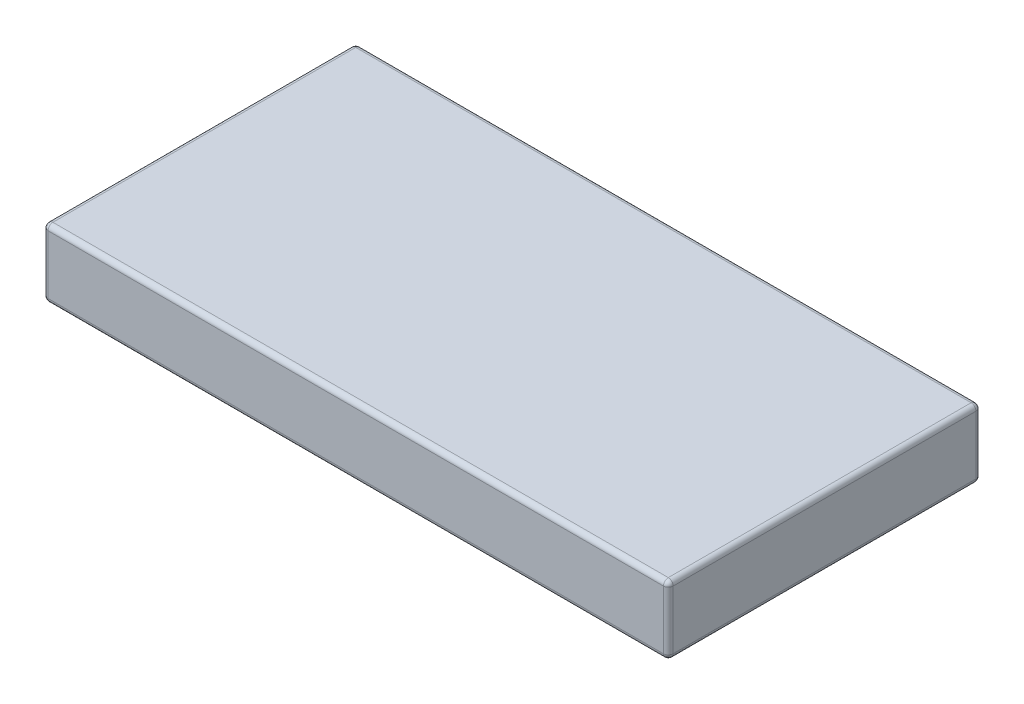
ISO-10303-21;
HEADER;
FILE_DESCRIPTION(('STEP AP214'),'2;1');
FILE_NAME('part.step','',(''),(''),'','','');
FILE_SCHEMA(('AUTOMOTIVE_DESIGN { 1 0 10303 214 1 1 1 1 }'));
ENDSEC;
DATA;
#1=APPLICATION_CONTEXT('core data for automotive mechanical design processes');
#2=APPLICATION_PROTOCOL_DEFINITION('international standard','automotive_design',2000,#1);
#3=PRODUCT_CONTEXT('',#1,'mechanical');
#4=PRODUCT('Part','Part','',(#3));
#5=PRODUCT_RELATED_PRODUCT_CATEGORY('part','',(#4));
#6=PRODUCT_DEFINITION_FORMATION('','',#4);
#7=PRODUCT_DEFINITION_CONTEXT('part definition',#1,'design');
#8=PRODUCT_DEFINITION('design','',#6,#7);
#9=PRODUCT_DEFINITION_SHAPE('','',#8);
#10=(LENGTH_UNIT() NAMED_UNIT(*) SI_UNIT(.MILLI.,.METRE.));
#11=(NAMED_UNIT(*) PLANE_ANGLE_UNIT() SI_UNIT($,.RADIAN.));
#12=(NAMED_UNIT(*) SI_UNIT($,.STERADIAN.) SOLID_ANGLE_UNIT());
#13=UNCERTAINTY_MEASURE_WITH_UNIT(LENGTH_MEASURE(1.E-05),#10,'distance_accuracy_value','');
#14=(GEOMETRIC_REPRESENTATION_CONTEXT(3) GLOBAL_UNCERTAINTY_ASSIGNED_CONTEXT((#13)) GLOBAL_UNIT_ASSIGNED_CONTEXT((#10,
#11,#12)) REPRESENTATION_CONTEXT('',''));
#15=CARTESIAN_POINT('',(0.,0.,0.));
#16=DIRECTION('',(0.,0.,1.));
#17=DIRECTION('',(1.,0.,0.));
#18=AXIS2_PLACEMENT_3D('',#15,#16,#17);
#19=CARTESIAN_POINT('',(-3.15,0.65,-1.55));
#20=DIRECTION('',(1.,0.,0.));
#21=DIRECTION('',(0.,0.,-1.));
#22=AXIS2_PLACEMENT_3D('',#19,#20,#21);
#23=SPHERICAL_SURFACE('',#22,0.05);
#24=CARTESIAN_POINT('',(-3.15,0.65,-1.55));
#25=DIRECTION('',(0.,0.,1.));
#26=DIRECTION('',(1.,0.,0.));
#27=AXIS2_PLACEMENT_3D('',#24,#25,#26);
#28=CIRCLE('',#27,0.05);
#29=CARTESIAN_POINT('',(-3.15,0.7,-1.55));
#30=VERTEX_POINT('',#29);
#31=CARTESIAN_POINT('',(-3.2,0.65,-1.55));
#32=VERTEX_POINT('',#31);
#33=EDGE_CURVE('E124',#30,#32,#28,.T.);
#34=ORIENTED_EDGE('',*,*,#33,.F.);
#35=CARTESIAN_POINT('',(-3.15,0.65,-1.55));
#36=DIRECTION('',(-1.,0.,0.));
#37=DIRECTION('',(0.,0.,1.));
#38=AXIS2_PLACEMENT_3D('',#35,#36,#37);
#39=CIRCLE('',#38,0.05);
#40=CARTESIAN_POINT('',(-3.15,0.65,-1.6));
#41=VERTEX_POINT('',#40);
#42=EDGE_CURVE('E277',#41,#30,#39,.F.);
#43=ORIENTED_EDGE('',*,*,#42,.F.);
#44=CARTESIAN_POINT('',(-3.15,0.65,-1.55));
#45=DIRECTION('',(0.,-1.,0.));
#46=DIRECTION('',(0.,0.,-1.));
#47=AXIS2_PLACEMENT_3D('',#44,#45,#46);
#48=CIRCLE('',#47,0.05);
#49=EDGE_CURVE('E274',#32,#41,#48,.T.);
#50=ORIENTED_EDGE('',*,*,#49,.F.);
#51=EDGE_LOOP('',(#34,#43,#50));
#52=FACE_BOUND('',#51,.T.);
#53=ADVANCED_FACE('F17',(#52),#23,.T.);
#54=CARTESIAN_POINT('',(3.15,0.65,-1.55));
#55=DIRECTION('',(1.,0.,0.));
#56=DIRECTION('',(0.,0.,-1.));
#57=AXIS2_PLACEMENT_3D('',#54,#55,#56);
#58=SPHERICAL_SURFACE('',#57,0.05);
#59=CARTESIAN_POINT('',(3.15,0.65,-1.55));
#60=DIRECTION('',(0.,0.,-1.));
#61=DIRECTION('',(-1.,0.,0.));
#62=AXIS2_PLACEMENT_3D('',#59,#60,#61);
#63=CIRCLE('',#62,0.05);
#64=CARTESIAN_POINT('',(3.2,0.65,-1.55));
#65=VERTEX_POINT('',#64);
#66=CARTESIAN_POINT('',(3.15,0.7,-1.55));
#67=VERTEX_POINT('',#66);
#68=EDGE_CURVE('E265',#65,#67,#63,.F.);
#69=ORIENTED_EDGE('',*,*,#68,.F.);
#70=CARTESIAN_POINT('',(3.15,0.65,-1.55));
#71=DIRECTION('',(0.,-1.,0.));
#72=DIRECTION('',(0.,0.,-1.));
#73=AXIS2_PLACEMENT_3D('',#70,#71,#72);
#74=CIRCLE('',#73,0.05);
#75=CARTESIAN_POINT('',(3.15,0.65,-1.6));
#76=VERTEX_POINT('',#75);
#77=EDGE_CURVE('E260',#76,#65,#74,.T.);
#78=ORIENTED_EDGE('',*,*,#77,.F.);
#79=CARTESIAN_POINT('',(3.15,0.65,-1.55));
#80=DIRECTION('',(-1.,0.,0.));
#81=DIRECTION('',(0.,0.,1.));
#82=AXIS2_PLACEMENT_3D('',#79,#80,#81);
#83=CIRCLE('',#82,0.05);
#84=EDGE_CURVE('E271',#67,#76,#83,.T.);
#85=ORIENTED_EDGE('',*,*,#84,.F.);
#86=EDGE_LOOP('',(#69,#78,#85));
#87=FACE_BOUND('',#86,.T.);
#88=ADVANCED_FACE('F152',(#87),#58,.T.);
#89=CARTESIAN_POINT('',(-3.15,0.65,1.55));
#90=DIRECTION('',(1.,0.,0.));
#91=DIRECTION('',(0.,0.,-1.));
#92=AXIS2_PLACEMENT_3D('',#89,#90,#91);
#93=SPHERICAL_SURFACE('',#92,0.05);
#94=CARTESIAN_POINT('',(-3.15,0.65,1.55));
#95=DIRECTION('',(0.,-1.,0.));
#96=DIRECTION('',(0.,0.,-1.));
#97=AXIS2_PLACEMENT_3D('',#94,#95,#96);
#98=CIRCLE('',#97,0.05);
#99=CARTESIAN_POINT('',(-3.15,0.65,1.6));
#100=VERTEX_POINT('',#99);
#101=CARTESIAN_POINT('',(-3.2,0.65,1.55));
#102=VERTEX_POINT('',#101);
#103=EDGE_CURVE('E132',#100,#102,#98,.T.);
#104=ORIENTED_EDGE('',*,*,#103,.F.);
#105=CARTESIAN_POINT('',(-3.15,0.65,1.55));
#106=DIRECTION('',(1.,0.,0.));
#107=DIRECTION('',(0.,0.,-1.));
#108=AXIS2_PLACEMENT_3D('',#105,#106,#107);
#109=CIRCLE('',#108,0.05);
#110=CARTESIAN_POINT('',(-3.15,0.7,1.55));
#111=VERTEX_POINT('',#110);
#112=EDGE_CURVE('E110',#111,#100,#109,.T.);
#113=ORIENTED_EDGE('',*,*,#112,.F.);
#114=CARTESIAN_POINT('',(-3.15,0.65,1.55));
#115=DIRECTION('',(0.,0.,1.));
#116=DIRECTION('',(1.,0.,0.));
#117=AXIS2_PLACEMENT_3D('',#114,#115,#116);
#118=CIRCLE('',#117,0.05);
#119=EDGE_CURVE('E125',#102,#111,#118,.F.);
#120=ORIENTED_EDGE('',*,*,#119,.F.);
#121=EDGE_LOOP('',(#104,#113,#120));
#122=FACE_BOUND('',#121,.T.);
#123=ADVANCED_FACE('F129',(#122),#93,.T.);
#124=CARTESIAN_POINT('',(3.15,0.65,1.55));
#125=DIRECTION('',(1.,0.,0.));
#126=DIRECTION('',(0.,0.,-1.));
#127=AXIS2_PLACEMENT_3D('',#124,#125,#126);
#128=SPHERICAL_SURFACE('',#127,0.05);
#129=CARTESIAN_POINT('',(3.15,0.65,1.55));
#130=DIRECTION('',(0.,-1.,0.));
#131=DIRECTION('',(0.,0.,-1.));
#132=AXIS2_PLACEMENT_3D('',#129,#130,#131);
#133=CIRCLE('',#132,0.05);
#134=CARTESIAN_POINT('',(3.2,0.65,1.55));
#135=VERTEX_POINT('',#134);
#136=CARTESIAN_POINT('',(3.15,0.65,1.6));
#137=VERTEX_POINT('',#136);
#138=EDGE_CURVE('E257',#135,#137,#133,.T.);
#139=ORIENTED_EDGE('',*,*,#138,.F.);
#140=CARTESIAN_POINT('',(3.15,0.65,1.55));
#141=DIRECTION('',(0.,0.,-1.));
#142=DIRECTION('',(-1.,0.,0.));
#143=AXIS2_PLACEMENT_3D('',#140,#141,#142);
#144=CIRCLE('',#143,0.05);
#145=CARTESIAN_POINT('',(3.15,0.7,1.55));
#146=VERTEX_POINT('',#145);
#147=EDGE_CURVE('E268',#146,#135,#144,.T.);
#148=ORIENTED_EDGE('',*,*,#147,.F.);
#149=CARTESIAN_POINT('',(3.15,0.65,1.55));
#150=DIRECTION('',(1.,0.,0.));
#151=DIRECTION('',(0.,0.,-1.));
#152=AXIS2_PLACEMENT_3D('',#149,#150,#151);
#153=CIRCLE('',#152,0.05);
#154=EDGE_CURVE('E112',#137,#146,#153,.F.);
#155=ORIENTED_EDGE('',*,*,#154,.F.);
#156=EDGE_LOOP('',(#139,#148,#155));
#157=FACE_BOUND('',#156,.T.);
#158=ADVANCED_FACE('F145',(#157),#128,.T.);
#159=CARTESIAN_POINT('',(-3.15,0.65,-1.6));
#160=DIRECTION('',(0.,0.,1.));
#161=DIRECTION('',(1.,0.,0.));
#162=AXIS2_PLACEMENT_3D('',#159,#160,#161);
#163=CYLINDRICAL_SURFACE('',#162,0.05);
#164=ORIENTED_EDGE('',*,*,#33,.T.);
#165=DIRECTION('',(0.,0.,-1.));
#166=VECTOR('',#165,1.);
#167=CARTESIAN_POINT('',(-3.2,0.65,1.6));
#168=LINE('',#167,#166);
#169=EDGE_CURVE('E137',#32,#102,#168,.F.);
#170=ORIENTED_EDGE('',*,*,#169,.T.);
#171=ORIENTED_EDGE('',*,*,#119,.T.);
#172=DIRECTION('',(0.,0.,1.));
#173=VECTOR('',#172,1.);
#174=CARTESIAN_POINT('',(-3.15,0.7,-1.6));
#175=LINE('',#174,#173);
#176=EDGE_CURVE('E119',#111,#30,#175,.F.);
#177=ORIENTED_EDGE('',*,*,#176,.T.);
#178=EDGE_LOOP('',(#164,#170,#171,#177));
#179=FACE_BOUND('',#178,.T.);
#180=ADVANCED_FACE('F135',(#179),#163,.T.);
#181=CARTESIAN_POINT('',(-3.15,0.7,-1.55));
#182=DIRECTION('',(0.,-1.,0.));
#183=DIRECTION('',(0.,0.,-1.));
#184=AXIS2_PLACEMENT_3D('',#181,#182,#183);
#185=CYLINDRICAL_SURFACE('',#184,0.05);
#186=ORIENTED_EDGE('',*,*,#49,.T.);
#187=DIRECTION('',(0.,1.,0.));
#188=VECTOR('',#187,1.);
#189=CARTESIAN_POINT('',(-3.15,0.7,-1.6));
#190=LINE('',#189,#188);
#191=CARTESIAN_POINT('',(-3.15,0.05,-1.6));
#192=VERTEX_POINT('',#191);
#193=EDGE_CURVE('E358',#41,#192,#190,.F.);
#194=ORIENTED_EDGE('',*,*,#193,.T.);
#195=CARTESIAN_POINT('',(-3.15,0.05,-1.55));
#196=DIRECTION('',(0.,1.,0.));
#197=DIRECTION('',(1.,0.,0.));
#198=AXIS2_PLACEMENT_3D('',#195,#196,#197);
#199=CIRCLE('',#198,0.05);
#200=CARTESIAN_POINT('',(-3.2,0.05,-1.55));
#201=VERTEX_POINT('',#200);
#202=EDGE_CURVE('E246',#201,#192,#199,.F.);
#203=ORIENTED_EDGE('',*,*,#202,.F.);
#204=DIRECTION('',(0.,1.,0.));
#205=VECTOR('',#204,1.);
#206=CARTESIAN_POINT('',(-3.2,0.7,-1.55));
#207=LINE('',#206,#205);
#208=EDGE_CURVE('E252',#201,#32,#207,.T.);
#209=ORIENTED_EDGE('',*,*,#208,.T.);
#210=EDGE_LOOP('',(#186,#194,#203,#209));
#211=FACE_BOUND('',#210,.T.);
#212=ADVANCED_FACE('F363',(#211),#185,.T.);
#213=CARTESIAN_POINT('',(3.15,0.65,-1.6));
#214=DIRECTION('',(0.,0.,-1.));
#215=DIRECTION('',(-1.,0.,0.));
#216=AXIS2_PLACEMENT_3D('',#213,#214,#215);
#217=CYLINDRICAL_SURFACE('',#216,0.05);
#218=ORIENTED_EDGE('',*,*,#68,.T.);
#219=DIRECTION('',(0.,0.,-1.));
#220=VECTOR('',#219,1.);
#221=CARTESIAN_POINT('',(3.15,0.7,-1.6));
#222=LINE('',#221,#220);
#223=EDGE_CURVE('E263',#67,#146,#222,.F.);
#224=ORIENTED_EDGE('',*,*,#223,.T.);
#225=ORIENTED_EDGE('',*,*,#147,.T.);
#226=DIRECTION('',(0.,0.,1.));
#227=VECTOR('',#226,1.);
#228=CARTESIAN_POINT('',(3.2,0.65,1.6));
#229=LINE('',#228,#227);
#230=EDGE_CURVE('E215',#135,#65,#229,.F.);
#231=ORIENTED_EDGE('',*,*,#230,.T.);
#232=EDGE_LOOP('',(#218,#224,#225,#231));
#233=FACE_BOUND('',#232,.T.);
#234=ADVANCED_FACE('F345',(#233),#217,.T.);
#235=CARTESIAN_POINT('',(3.15,0.7,-1.55));
#236=DIRECTION('',(0.,-1.,0.));
#237=DIRECTION('',(0.,0.,-1.));
#238=AXIS2_PLACEMENT_3D('',#235,#236,#237);
#239=CYLINDRICAL_SURFACE('',#238,0.05);
#240=CARTESIAN_POINT('',(3.15,0.05,-1.55));
#241=DIRECTION('',(0.,1.,0.));
#242=DIRECTION('',(1.,0.,0.));
#243=AXIS2_PLACEMENT_3D('',#240,#241,#242);
#244=CIRCLE('',#243,0.05);
#245=CARTESIAN_POINT('',(3.15,0.05,-1.6));
#246=VERTEX_POINT('',#245);
#247=CARTESIAN_POINT('',(3.2,0.05,-1.55));
#248=VERTEX_POINT('',#247);
#249=EDGE_CURVE('E221',#246,#248,#244,.F.);
#250=ORIENTED_EDGE('',*,*,#249,.F.);
#251=DIRECTION('',(0.,1.,0.));
#252=VECTOR('',#251,1.);
#253=CARTESIAN_POINT('',(3.15,0.7,-1.6));
#254=LINE('',#253,#252);
#255=EDGE_CURVE('E357',#246,#76,#254,.T.);
#256=ORIENTED_EDGE('',*,*,#255,.T.);
#257=ORIENTED_EDGE('',*,*,#77,.T.);
#258=DIRECTION('',(0.,1.,0.));
#259=VECTOR('',#258,1.);
#260=CARTESIAN_POINT('',(3.2,0.7,-1.55));
#261=LINE('',#260,#259);
#262=EDGE_CURVE('E213',#65,#248,#261,.F.);
#263=ORIENTED_EDGE('',*,*,#262,.T.);
#264=EDGE_LOOP('',(#250,#256,#257,#263));
#265=FACE_BOUND('',#264,.T.);
#266=ADVANCED_FACE('F352',(#265),#239,.T.);
#267=CARTESIAN_POINT('',(3.15,0.7,1.55));
#268=DIRECTION('',(0.,-1.,0.));
#269=DIRECTION('',(0.,0.,-1.));
#270=AXIS2_PLACEMENT_3D('',#267,#268,#269);
#271=CYLINDRICAL_SURFACE('',#270,0.05);
#272=CARTESIAN_POINT('',(3.15,0.05,1.55));
#273=DIRECTION('',(0.,-1.,9.5846697953635E-13));
#274=DIRECTION('',(1.,0.,0.));
#275=AXIS2_PLACEMENT_3D('',#272,#273,#274);
#276=CIRCLE('',#275,0.05);
#277=CARTESIAN_POINT('',(3.2,0.05,1.55));
#278=VERTEX_POINT('',#277);
#279=CARTESIAN_POINT('',(3.15,0.050000000000006,1.6));
#280=VERTEX_POINT('',#279);
#281=EDGE_CURVE('E206',#278,#280,#276,.T.);
#282=ORIENTED_EDGE('',*,*,#281,.F.);
#283=DIRECTION('',(0.,1.,0.));
#284=VECTOR('',#283,1.);
#285=CARTESIAN_POINT('',(3.2,0.7,1.55));
#286=LINE('',#285,#284);
#287=EDGE_CURVE('E218',#278,#135,#286,.T.);
#288=ORIENTED_EDGE('',*,*,#287,.T.);
#289=ORIENTED_EDGE('',*,*,#138,.T.);
#290=DIRECTION('',(0.,1.,0.));
#291=VECTOR('',#290,1.);
#292=CARTESIAN_POINT('',(3.15,0.7,1.6));
#293=LINE('',#292,#291);
#294=EDGE_CURVE('E204',#137,#280,#293,.F.);
#295=ORIENTED_EDGE('',*,*,#294,.T.);
#296=EDGE_LOOP('',(#282,#288,#289,#295));
#297=FACE_BOUND('',#296,.T.);
#298=ADVANCED_FACE('F329',(#297),#271,.T.);
#299=CARTESIAN_POINT('',(-3.15,0.7,1.55));
#300=DIRECTION('',(0.,-1.,0.));
#301=DIRECTION('',(0.,0.,-1.));
#302=AXIS2_PLACEMENT_3D('',#299,#300,#301);
#303=CYLINDRICAL_SURFACE('',#302,0.05);
#304=CARTESIAN_POINT('',(-3.15,0.05,1.55));
#305=DIRECTION('',(0.,-1.,0.));
#306=DIRECTION('',(1.,0.,0.));
#307=AXIS2_PLACEMENT_3D('',#304,#305,#306);
#308=CIRCLE('',#307,0.05);
#309=CARTESIAN_POINT('',(-3.15,0.05,1.6));
#310=VERTEX_POINT('',#309);
#311=CARTESIAN_POINT('',(-3.2,0.05,1.55));
#312=VERTEX_POINT('',#311);
#313=EDGE_CURVE('E208',#310,#312,#308,.T.);
#314=ORIENTED_EDGE('',*,*,#313,.F.);
#315=DIRECTION('',(0.,1.,0.));
#316=VECTOR('',#315,1.);
#317=CARTESIAN_POINT('',(-3.15,0.7,1.6));
#318=LINE('',#317,#316);
#319=EDGE_CURVE('E116',#310,#100,#318,.T.);
#320=ORIENTED_EDGE('',*,*,#319,.T.);
#321=ORIENTED_EDGE('',*,*,#103,.T.);
#322=DIRECTION('',(0.,1.,0.));
#323=VECTOR('',#322,1.);
#324=CARTESIAN_POINT('',(-3.2,0.7,1.55));
#325=LINE('',#324,#323);
#326=EDGE_CURVE('E249',#102,#312,#325,.F.);
#327=ORIENTED_EDGE('',*,*,#326,.T.);
#328=EDGE_LOOP('',(#314,#320,#321,#327));
#329=FACE_BOUND('',#328,.T.);
#330=ADVANCED_FACE('F290',(#329),#303,.T.);
#331=CARTESIAN_POINT('',(3.2,0.7,-1.6));
#332=DIRECTION('',(0.,-1.,0.));
#333=DIRECTION('',(0.,0.,-1.));
#334=AXIS2_PLACEMENT_3D('',#331,#332,#333);
#335=PLANE('',#334);
#336=DIRECTION('',(-1.,0.,0.));
#337=VECTOR('',#336,1.);
#338=CARTESIAN_POINT('',(3.2,0.7,-1.55));
#339=LINE('',#338,#337);
#340=EDGE_CURVE('E101',#30,#67,#339,.F.);
#341=ORIENTED_EDGE('',*,*,#340,.F.);
#342=ORIENTED_EDGE('',*,*,#176,.F.);
#343=DIRECTION('',(1.,0.,0.));
#344=VECTOR('',#343,1.);
#345=CARTESIAN_POINT('',(3.2,0.7,1.55));
#346=LINE('',#345,#344);
#347=EDGE_CURVE('E107',#146,#111,#346,.F.);
#348=ORIENTED_EDGE('',*,*,#347,.F.);
#349=ORIENTED_EDGE('',*,*,#223,.F.);
#350=EDGE_LOOP('',(#341,#342,#348,#349));
#351=FACE_BOUND('',#350,.T.);
#352=ADVANCED_FACE('F120',(#351),#335,.F.);
#353=CARTESIAN_POINT('',(-3.2,0.7,1.6));
#354=DIRECTION('',(1.,0.,0.));
#355=DIRECTION('',(0.,0.,-1.));
#356=AXIS2_PLACEMENT_3D('',#353,#354,#355);
#357=PLANE('',#356);
#358=ORIENTED_EDGE('',*,*,#169,.F.);
#359=ORIENTED_EDGE('',*,*,#208,.F.);
#360=DIRECTION('',(0.,0.,-1.));
#361=VECTOR('',#360,1.);
#362=CARTESIAN_POINT('',(-3.2,0.05,1.6));
#363=LINE('',#362,#361);
#364=EDGE_CURVE('E286',#312,#201,#363,.T.);
#365=ORIENTED_EDGE('',*,*,#364,.F.);
#366=ORIENTED_EDGE('',*,*,#326,.F.);
#367=EDGE_LOOP('',(#358,#359,#365,#366));
#368=FACE_BOUND('',#367,.T.);
#369=ADVANCED_FACE('F239',(#368),#357,.F.);
#370=CARTESIAN_POINT('',(-3.15,0.05,-1.55));
#371=DIRECTION('',(1.,0.,0.));
#372=DIRECTION('',(0.,0.,-1.));
#373=AXIS2_PLACEMENT_3D('',#370,#371,#372);
#374=SPHERICAL_SURFACE('',#373,0.05);
#375=ORIENTED_EDGE('',*,*,#202,.T.);
#376=CARTESIAN_POINT('',(-3.15,0.05,-1.55));
#377=DIRECTION('',(1.,0.,0.));
#378=DIRECTION('',(0.,0.,-1.));
#379=AXIS2_PLACEMENT_3D('',#376,#377,#378);
#380=CIRCLE('',#379,0.05);
#381=CARTESIAN_POINT('',(-3.15,0.,-1.55));
#382=VERTEX_POINT('',#381);
#383=EDGE_CURVE('E319',#382,#192,#380,.T.);
#384=ORIENTED_EDGE('',*,*,#383,.F.);
#385=CARTESIAN_POINT('',(-3.15,0.05,-1.55));
#386=DIRECTION('',(0.,0.,-1.));
#387=DIRECTION('',(-1.,0.,0.));
#388=AXIS2_PLACEMENT_3D('',#385,#386,#387);
#389=CIRCLE('',#388,0.05);
#390=EDGE_CURVE('E322',#201,#382,#389,.F.);
#391=ORIENTED_EDGE('',*,*,#390,.F.);
#392=EDGE_LOOP('',(#375,#384,#391));
#393=FACE_BOUND('',#392,.T.);
#394=ADVANCED_FACE('F234',(#393),#374,.T.);
#395=CARTESIAN_POINT('',(3.2,0.65,-1.55));
#396=DIRECTION('',(-1.,0.,0.));
#397=DIRECTION('',(0.,0.,1.));
#398=AXIS2_PLACEMENT_3D('',#395,#396,#397);
#399=CYLINDRICAL_SURFACE('',#398,0.05);
#400=ORIENTED_EDGE('',*,*,#340,.T.);
#401=ORIENTED_EDGE('',*,*,#84,.T.);
#402=DIRECTION('',(1.,0.,0.));
#403=VECTOR('',#402,1.);
#404=CARTESIAN_POINT('',(-3.2,0.65,-1.6));
#405=LINE('',#404,#403);
#406=EDGE_CURVE('E317',#76,#41,#405,.F.);
#407=ORIENTED_EDGE('',*,*,#406,.T.);
#408=ORIENTED_EDGE('',*,*,#42,.T.);
#409=EDGE_LOOP('',(#400,#401,#407,#408));
#410=FACE_BOUND('',#409,.T.);
#411=ADVANCED_FACE('F230',(#410),#399,.T.);
#412=CARTESIAN_POINT('',(3.15,0.05,-1.55));
#413=DIRECTION('',(1.,0.,0.));
#414=DIRECTION('',(0.,0.,-1.));
#415=AXIS2_PLACEMENT_3D('',#412,#413,#414);
#416=SPHERICAL_SURFACE('',#415,0.05);
#417=CARTESIAN_POINT('',(3.15,0.05,-1.55));
#418=DIRECTION('',(1.,0.,0.));
#419=DIRECTION('',(0.,0.,-1.));
#420=AXIS2_PLACEMENT_3D('',#417,#418,#419);
#421=CIRCLE('',#420,0.05);
#422=CARTESIAN_POINT('',(3.15,0.,-1.55));
#423=VERTEX_POINT('',#422);
#424=EDGE_CURVE('E314',#246,#423,#421,.F.);
#425=ORIENTED_EDGE('',*,*,#424,.F.);
#426=ORIENTED_EDGE('',*,*,#249,.T.);
#427=CARTESIAN_POINT('',(3.15,0.05,-1.55));
#428=DIRECTION('',(0.,0.,1.));
#429=DIRECTION('',(1.,0.,0.));
#430=AXIS2_PLACEMENT_3D('',#427,#428,#429);
#431=CIRCLE('',#430,0.05);
#432=EDGE_CURVE('E305',#423,#248,#431,.T.);
#433=ORIENTED_EDGE('',*,*,#432,.F.);
#434=EDGE_LOOP('',(#425,#426,#433));
#435=FACE_BOUND('',#434,.T.);
#436=ADVANCED_FACE('F226',(#435),#416,.T.);
#437=CARTESIAN_POINT('',(3.2,0.7,1.6));
#438=DIRECTION('',(-1.,0.,0.));
#439=DIRECTION('',(0.,0.,1.));
#440=AXIS2_PLACEMENT_3D('',#437,#438,#439);
#441=PLANE('',#440);
#442=ORIENTED_EDGE('',*,*,#230,.F.);
#443=ORIENTED_EDGE('',*,*,#287,.F.);
#444=DIRECTION('',(0.,0.,1.));
#445=VECTOR('',#444,1.);
#446=CARTESIAN_POINT('',(3.2,0.05,1.6));
#447=LINE('',#446,#445);
#448=EDGE_CURVE('E299',#248,#278,#447,.T.);
#449=ORIENTED_EDGE('',*,*,#448,.F.);
#450=ORIENTED_EDGE('',*,*,#262,.F.);
#451=EDGE_LOOP('',(#442,#443,#449,#450));
#452=FACE_BOUND('',#451,.T.);
#453=ADVANCED_FACE('F229',(#452),#441,.F.);
#454=CARTESIAN_POINT('',(-3.15,0.05,1.55));
#455=DIRECTION('',(1.,0.,0.));
#456=DIRECTION('',(0.,0.,-1.));
#457=AXIS2_PLACEMENT_3D('',#454,#455,#456);
#458=SPHERICAL_SURFACE('',#457,0.05);
#459=ORIENTED_EDGE('',*,*,#313,.T.);
#460=CARTESIAN_POINT('',(-3.15,0.05,1.55));
#461=DIRECTION('',(0.,0.,-1.));
#462=DIRECTION('',(-1.,0.,0.));
#463=AXIS2_PLACEMENT_3D('',#460,#461,#462);
#464=CIRCLE('',#463,0.05);
#465=CARTESIAN_POINT('',(-3.15,0.,1.55));
#466=VERTEX_POINT('',#465);
#467=EDGE_CURVE('E115',#466,#312,#464,.T.);
#468=ORIENTED_EDGE('',*,*,#467,.F.);
#469=CARTESIAN_POINT('',(-3.15,0.05,1.55));
#470=DIRECTION('',(-1.,0.,0.));
#471=DIRECTION('',(0.,0.,1.));
#472=AXIS2_PLACEMENT_3D('',#469,#470,#471);
#473=CIRCLE('',#472,0.05);
#474=EDGE_CURVE('E296',#310,#466,#473,.F.);
#475=ORIENTED_EDGE('',*,*,#474,.F.);
#476=EDGE_LOOP('',(#459,#468,#475));
#477=FACE_BOUND('',#476,.T.);
#478=ADVANCED_FACE('F197',(#477),#458,.T.);
#479=CARTESIAN_POINT('',(3.15,0.05,1.55));
#480=DIRECTION('',(1.,0.,0.));
#481=DIRECTION('',(0.,0.,-1.));
#482=AXIS2_PLACEMENT_3D('',#479,#480,#481);
#483=SPHERICAL_SURFACE('',#482,0.05);
#484=CARTESIAN_POINT('',(3.15,0.05,1.55));
#485=DIRECTION('',(-1.,0.,0.));
#486=DIRECTION('',(0.,0.,1.));
#487=AXIS2_PLACEMENT_3D('',#484,#485,#486);
#488=CIRCLE('',#487,0.05);
#489=CARTESIAN_POINT('',(3.15,0.,1.55));
#490=VERTEX_POINT('',#489);
#491=EDGE_CURVE('E298',#490,#280,#488,.T.);
#492=ORIENTED_EDGE('',*,*,#491,.F.);
#493=CARTESIAN_POINT('',(3.15,0.05,1.55));
#494=DIRECTION('',(0.,0.,1.));
#495=DIRECTION('',(1.,0.,0.));
#496=AXIS2_PLACEMENT_3D('',#493,#494,#495);
#497=CIRCLE('',#496,0.05);
#498=EDGE_CURVE('E311',#278,#490,#497,.F.);
#499=ORIENTED_EDGE('',*,*,#498,.F.);
#500=ORIENTED_EDGE('',*,*,#281,.T.);
#501=EDGE_LOOP('',(#492,#499,#500));
#502=FACE_BOUND('',#501,.T.);
#503=ADVANCED_FACE('F193',(#502),#483,.T.);
#504=CARTESIAN_POINT('',(3.2,0.65,1.55));
#505=DIRECTION('',(1.,0.,0.));
#506=DIRECTION('',(0.,0.,-1.));
#507=AXIS2_PLACEMENT_3D('',#504,#505,#506);
#508=CYLINDRICAL_SURFACE('',#507,0.05);
#509=DIRECTION('',(-1.,0.,0.));
#510=VECTOR('',#509,1.);
#511=CARTESIAN_POINT('',(-3.2,0.65,1.6));
#512=LINE('',#511,#510);
#513=EDGE_CURVE('E302',#100,#137,#512,.F.);
#514=ORIENTED_EDGE('',*,*,#513,.T.);
#515=ORIENTED_EDGE('',*,*,#154,.T.);
#516=ORIENTED_EDGE('',*,*,#347,.T.);
#517=ORIENTED_EDGE('',*,*,#112,.T.);
#518=EDGE_LOOP('',(#514,#515,#516,#517));
#519=FACE_BOUND('',#518,.T.);
#520=ADVANCED_FACE('F108',(#519),#508,.T.);
#521=CARTESIAN_POINT('',(-3.15,0.05,1.6));
#522=DIRECTION('',(0.,0.,-1.));
#523=DIRECTION('',(-1.,0.,0.));
#524=AXIS2_PLACEMENT_3D('',#521,#522,#523);
#525=CYLINDRICAL_SURFACE('',#524,0.05);
#526=ORIENTED_EDGE('',*,*,#390,.T.);
#527=DIRECTION('',(0.,0.,-1.));
#528=VECTOR('',#527,1.);
#529=CARTESIAN_POINT('',(-3.15,0.,-1.6));
#530=LINE('',#529,#528);
#531=EDGE_CURVE('E334',#466,#382,#530,.T.);
#532=ORIENTED_EDGE('',*,*,#531,.F.);
#533=ORIENTED_EDGE('',*,*,#467,.T.);
#534=ORIENTED_EDGE('',*,*,#364,.T.);
#535=EDGE_LOOP('',(#526,#532,#533,#534));
#536=FACE_BOUND('',#535,.T.);
#537=ADVANCED_FACE('F186',(#536),#525,.T.);
#538=CARTESIAN_POINT('',(-3.2,0.7,-1.6));
#539=DIRECTION('',(0.,0.,1.));
#540=DIRECTION('',(1.,0.,0.));
#541=AXIS2_PLACEMENT_3D('',#538,#539,#540);
#542=PLANE('',#541);
#543=DIRECTION('',(1.,0.,0.));
#544=VECTOR('',#543,1.);
#545=CARTESIAN_POINT('',(-3.2,0.05,-1.6));
#546=LINE('',#545,#544);
#547=EDGE_CURVE('E337',#192,#246,#546,.T.);
#548=ORIENTED_EDGE('',*,*,#547,.F.);
#549=ORIENTED_EDGE('',*,*,#193,.F.);
#550=ORIENTED_EDGE('',*,*,#406,.F.);
#551=ORIENTED_EDGE('',*,*,#255,.F.);
#552=EDGE_LOOP('',(#548,#549,#550,#551));
#553=FACE_BOUND('',#552,.T.);
#554=ADVANCED_FACE('F182',(#553),#542,.F.);
#555=CARTESIAN_POINT('',(3.15,0.05,1.6));
#556=DIRECTION('',(0.,0.,1.));
#557=DIRECTION('',(1.,0.,0.));
#558=AXIS2_PLACEMENT_3D('',#555,#556,#557);
#559=CYLINDRICAL_SURFACE('',#558,0.05);
#560=ORIENTED_EDGE('',*,*,#432,.T.);
#561=ORIENTED_EDGE('',*,*,#448,.T.);
#562=ORIENTED_EDGE('',*,*,#498,.T.);
#563=DIRECTION('',(0.,0.,-1.));
#564=VECTOR('',#563,1.);
#565=CARTESIAN_POINT('',(3.15,0.,-1.6));
#566=LINE('',#565,#564);
#567=EDGE_CURVE('E336',#423,#490,#566,.F.);
#568=ORIENTED_EDGE('',*,*,#567,.F.);
#569=EDGE_LOOP('',(#560,#561,#562,#568));
#570=FACE_BOUND('',#569,.T.);
#571=ADVANCED_FACE('F178',(#570),#559,.T.);
#572=CARTESIAN_POINT('',(-3.2,0.7,1.6));
#573=DIRECTION('',(0.,0.,-1.));
#574=DIRECTION('',(-1.,0.,0.));
#575=AXIS2_PLACEMENT_3D('',#572,#573,#574);
#576=PLANE('',#575);
#577=ORIENTED_EDGE('',*,*,#513,.F.);
#578=ORIENTED_EDGE('',*,*,#319,.F.);
#579=DIRECTION('',(-1.,0.,0.));
#580=VECTOR('',#579,1.);
#581=CARTESIAN_POINT('',(-3.2,0.05,1.6));
#582=LINE('',#581,#580);
#583=EDGE_CURVE('E333',#280,#310,#582,.T.);
#584=ORIENTED_EDGE('',*,*,#583,.F.);
#585=ORIENTED_EDGE('',*,*,#294,.F.);
#586=EDGE_LOOP('',(#577,#578,#584,#585));
#587=FACE_BOUND('',#586,.T.);
#588=ADVANCED_FACE('F174',(#587),#576,.F.);
#589=CARTESIAN_POINT('',(-3.2,0.05,-1.55));
#590=DIRECTION('',(1.,0.,0.));
#591=DIRECTION('',(0.,0.,-1.));
#592=AXIS2_PLACEMENT_3D('',#589,#590,#591);
#593=CYLINDRICAL_SURFACE('',#592,0.05);
#594=ORIENTED_EDGE('',*,*,#547,.T.);
#595=ORIENTED_EDGE('',*,*,#424,.T.);
#596=DIRECTION('',(1.,0.,0.));
#597=VECTOR('',#596,1.);
#598=CARTESIAN_POINT('',(3.2,0.,-1.55));
#599=LINE('',#598,#597);
#600=EDGE_CURVE('E26',#382,#423,#599,.T.);
#601=ORIENTED_EDGE('',*,*,#600,.F.);
#602=ORIENTED_EDGE('',*,*,#383,.T.);
#603=EDGE_LOOP('',(#594,#595,#601,#602));
#604=FACE_BOUND('',#603,.T.);
#605=ADVANCED_FACE('F168',(#604),#593,.T.);
#606=CARTESIAN_POINT('',(-3.2,0.05,1.55));
#607=DIRECTION('',(-1.,0.,0.));
#608=DIRECTION('',(0.,0.,1.));
#609=AXIS2_PLACEMENT_3D('',#606,#607,#608);
#610=CYLINDRICAL_SURFACE('',#609,0.05);
#611=DIRECTION('',(1.,0.,0.));
#612=VECTOR('',#611,1.);
#613=CARTESIAN_POINT('',(3.2,0.,1.55));
#614=LINE('',#613,#612);
#615=EDGE_CURVE('E11',#490,#466,#614,.F.);
#616=ORIENTED_EDGE('',*,*,#615,.F.);
#617=ORIENTED_EDGE('',*,*,#491,.T.);
#618=ORIENTED_EDGE('',*,*,#583,.T.);
#619=ORIENTED_EDGE('',*,*,#474,.T.);
#620=EDGE_LOOP('',(#616,#617,#618,#619));
#621=FACE_BOUND('',#620,.T.);
#622=ADVANCED_FACE('F163',(#621),#610,.T.);
#623=CARTESIAN_POINT('',(3.2,0.,-1.6));
#624=DIRECTION('',(0.,-1.,0.));
#625=DIRECTION('',(0.,0.,-1.));
#626=AXIS2_PLACEMENT_3D('',#623,#624,#625);
#627=PLANE('',#626);
#628=ORIENTED_EDGE('',*,*,#600,.T.);
#629=ORIENTED_EDGE('',*,*,#567,.T.);
#630=ORIENTED_EDGE('',*,*,#615,.T.);
#631=ORIENTED_EDGE('',*,*,#531,.T.);
#632=EDGE_LOOP('',(#628,#629,#630,#631));
#633=FACE_BOUND('',#632,.T.);
#634=ADVANCED_FACE('F161',(#633),#627,.T.);
#635=CLOSED_SHELL('',(#53,#88,#123,#158,#180,#212,#234,#266,#298,#330,#352,#369,#394,#411,#436,
#453,#478,#503,#520,#537,#554,#571,#588,#605,#622,#634));
#636=MANIFOLD_SOLID_BREP('B1',#635);
#637=ADVANCED_BREP_SHAPE_REPRESENTATION('',(#18,#636),#14);
#638=SHAPE_DEFINITION_REPRESENTATION(#9,#637);
ENDSEC;
END-ISO-10303-21;
